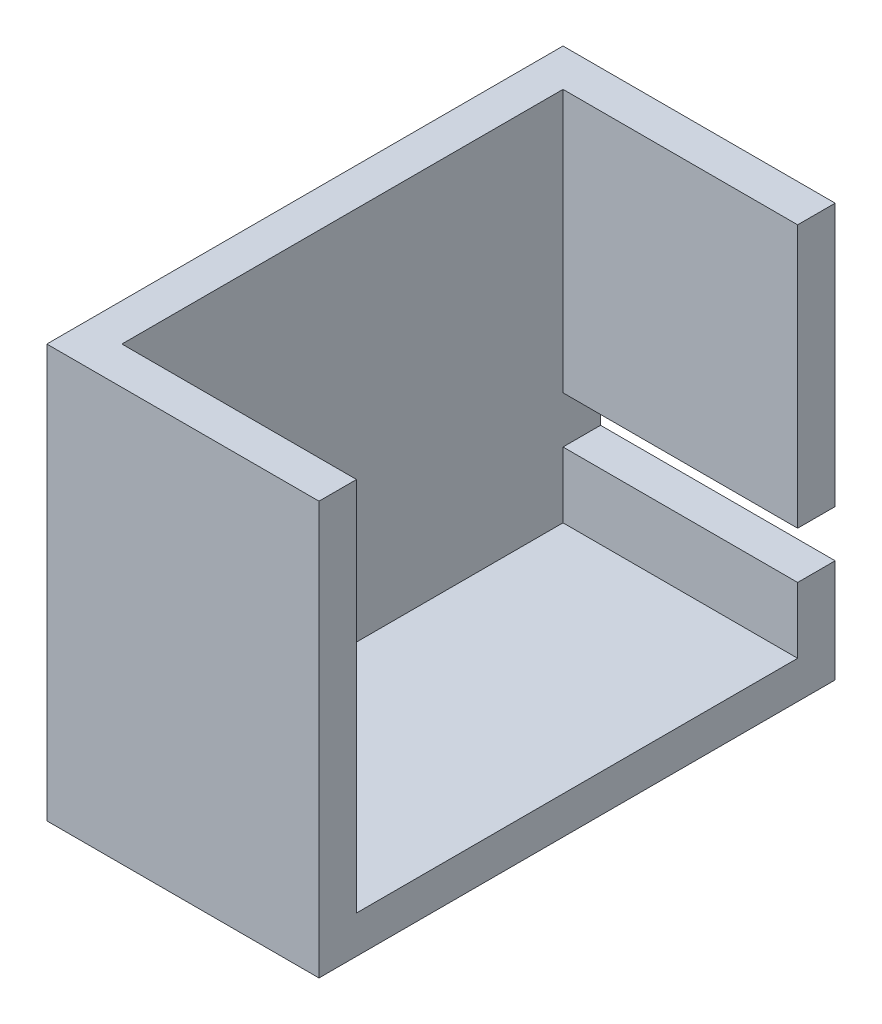
ISO-10303-21;
HEADER;
FILE_DESCRIPTION(('STEP AP214'),'2;1');
FILE_NAME('part.step','',(''),(''),'','','');
FILE_SCHEMA(('AUTOMOTIVE_DESIGN { 1 0 10303 214 1 1 1 1 }'));
ENDSEC;
DATA;
#1=APPLICATION_CONTEXT('core data for automotive mechanical design processes');
#2=APPLICATION_PROTOCOL_DEFINITION('international standard','automotive_design',2000,#1);
#3=PRODUCT_CONTEXT('',#1,'mechanical');
#4=PRODUCT('Part','Part','',(#3));
#5=PRODUCT_RELATED_PRODUCT_CATEGORY('part','',(#4));
#6=PRODUCT_DEFINITION_FORMATION('','',#4);
#7=PRODUCT_DEFINITION_CONTEXT('part definition',#1,'design');
#8=PRODUCT_DEFINITION('design','',#6,#7);
#9=PRODUCT_DEFINITION_SHAPE('','',#8);
#10=(LENGTH_UNIT() NAMED_UNIT(*) SI_UNIT(.MILLI.,.METRE.));
#11=(NAMED_UNIT(*) PLANE_ANGLE_UNIT() SI_UNIT($,.RADIAN.));
#12=(NAMED_UNIT(*) SI_UNIT($,.STERADIAN.) SOLID_ANGLE_UNIT());
#13=UNCERTAINTY_MEASURE_WITH_UNIT(LENGTH_MEASURE(1.E-05),#10,'distance_accuracy_value','');
#14=(GEOMETRIC_REPRESENTATION_CONTEXT(3) GLOBAL_UNCERTAINTY_ASSIGNED_CONTEXT((#13)) GLOBAL_UNIT_ASSIGNED_CONTEXT((#10,
#11,#12)) REPRESENTATION_CONTEXT('',''));
#15=CARTESIAN_POINT('',(0.,0.,0.));
#16=DIRECTION('',(0.,0.,1.));
#17=DIRECTION('',(1.,0.,0.));
#18=AXIS2_PLACEMENT_3D('',#15,#16,#17);
#19=CARTESIAN_POINT('',(12.5,0.,0.));
#20=DIRECTION('',(1.,0.,0.));
#21=DIRECTION('',(0.,0.,-1.));
#22=AXIS2_PLACEMENT_3D('',#19,#20,#21);
#23=PLANE('',#22);
#24=DIRECTION('',(0.,-1.,0.));
#25=VECTOR('',#24,1.);
#26=CARTESIAN_POINT('',(12.5,0.,23.5));
#27=LINE('',#26,#25);
#28=CARTESIAN_POINT('',(12.5,20.,23.5));
#29=VERTEX_POINT('',#28);
#30=CARTESIAN_POINT('',(12.5,0.,23.5));
#31=VERTEX_POINT('',#30);
#32=EDGE_CURVE('E197',#29,#31,#27,.T.);
#33=ORIENTED_EDGE('',*,*,#32,.F.);
#34=DIRECTION('',(0.,0.,1.));
#35=VECTOR('',#34,1.);
#36=CARTESIAN_POINT('',(12.5,20.,0.));
#37=LINE('',#36,#35);
#38=CARTESIAN_POINT('',(12.5,20.,25.5));
#39=VERTEX_POINT('',#38);
#40=EDGE_CURVE('E157',#29,#39,#37,.T.);
#41=ORIENTED_EDGE('',*,*,#40,.T.);
#42=DIRECTION('',(0.,-1.,0.));
#43=VECTOR('',#42,1.);
#44=CARTESIAN_POINT('',(12.5,0.,25.5));
#45=LINE('',#44,#43);
#46=CARTESIAN_POINT('',(12.5,-2.,25.5));
#47=VERTEX_POINT('',#46);
#48=EDGE_CURVE('E245',#39,#47,#45,.T.);
#49=ORIENTED_EDGE('',*,*,#48,.T.);
#50=DIRECTION('',(0.,0.,-1.));
#51=VECTOR('',#50,1.);
#52=CARTESIAN_POINT('',(12.5,-2.,0.));
#53=LINE('',#52,#51);
#54=CARTESIAN_POINT('',(12.5,-2.,-2.));
#55=VERTEX_POINT('',#54);
#56=EDGE_CURVE('E45',#47,#55,#53,.T.);
#57=ORIENTED_EDGE('',*,*,#56,.T.);
#58=DIRECTION('',(0.,1.,0.));
#59=VECTOR('',#58,1.);
#60=CARTESIAN_POINT('',(12.5,0.,-2.));
#61=LINE('',#60,#59);
#62=CARTESIAN_POINT('',(12.5,3.5,-2.));
#63=VERTEX_POINT('',#62);
#64=EDGE_CURVE('E238',#55,#63,#61,.T.);
#65=ORIENTED_EDGE('',*,*,#64,.T.);
#66=DIRECTION('',(0.,0.,-1.));
#67=VECTOR('',#66,1.);
#68=CARTESIAN_POINT('',(12.5,3.5,-2.));
#69=LINE('',#68,#67);
#70=CARTESIAN_POINT('',(12.5,3.5,0.));
#71=VERTEX_POINT('',#70);
#72=EDGE_CURVE('E168',#71,#63,#69,.T.);
#73=ORIENTED_EDGE('',*,*,#72,.F.);
#74=DIRECTION('',(0.,1.,0.));
#75=VECTOR('',#74,1.);
#76=CARTESIAN_POINT('',(12.5,0.,0.));
#77=LINE('',#76,#75);
#78=CARTESIAN_POINT('',(12.5,0.,0.));
#79=VERTEX_POINT('',#78);
#80=EDGE_CURVE('E193',#79,#71,#77,.T.);
#81=ORIENTED_EDGE('',*,*,#80,.F.);
#82=DIRECTION('',(0.,0.,-1.));
#83=VECTOR('',#82,1.);
#84=CARTESIAN_POINT('',(12.5,0.,0.));
#85=LINE('',#84,#83);
#86=EDGE_CURVE('E201',#31,#79,#85,.T.);
#87=ORIENTED_EDGE('',*,*,#86,.F.);
#88=EDGE_LOOP('',(#33,#41,#49,#57,#65,#73,#81,#87));
#89=FACE_BOUND('',#88,.T.);
#90=ADVANCED_FACE('F41',(#89),#23,.T.);
#91=CARTESIAN_POINT('',(12.5,0.,-2.));
#92=DIRECTION('',(0.,0.,1.));
#93=DIRECTION('',(1.,0.,0.));
#94=AXIS2_PLACEMENT_3D('',#91,#92,#93);
#95=PLANE('',#94);
#96=DIRECTION('',(-1.,0.,0.));
#97=VECTOR('',#96,1.);
#98=CARTESIAN_POINT('',(12.5,6.,-2.));
#99=LINE('',#98,#97);
#100=CARTESIAN_POINT('',(12.5,6.,-2.));
#101=VERTEX_POINT('',#100);
#102=CARTESIAN_POINT('',(0.,6.,-2.));
#103=VERTEX_POINT('',#102);
#104=EDGE_CURVE('E172',#101,#103,#99,.T.);
#105=ORIENTED_EDGE('',*,*,#104,.T.);
#106=DIRECTION('',(0.,1.,0.));
#107=VECTOR('',#106,1.);
#108=CARTESIAN_POINT('',(0.,6.,-2.));
#109=LINE('',#108,#107);
#110=CARTESIAN_POINT('',(0.,3.5,-2.));
#111=VERTEX_POINT('',#110);
#112=EDGE_CURVE('E169',#111,#103,#109,.T.);
#113=ORIENTED_EDGE('',*,*,#112,.F.);
#114=DIRECTION('',(-1.,0.,0.));
#115=VECTOR('',#114,1.);
#116=CARTESIAN_POINT('',(12.5,3.5,-2.));
#117=LINE('',#116,#115);
#118=EDGE_CURVE('E182',#63,#111,#117,.T.);
#119=ORIENTED_EDGE('',*,*,#118,.F.);
#120=ORIENTED_EDGE('',*,*,#64,.F.);
#121=DIRECTION('',(-1.,0.,0.));
#122=VECTOR('',#121,1.);
#123=CARTESIAN_POINT('',(12.5,-2.,-2.));
#124=LINE('',#123,#122);
#125=CARTESIAN_POINT('',(-2.,-2.,-2.));
#126=VERTEX_POINT('',#125);
#127=EDGE_CURVE('E219',#55,#126,#124,.T.);
#128=ORIENTED_EDGE('',*,*,#127,.T.);
#129=DIRECTION('',(0.,1.,0.));
#130=VECTOR('',#129,1.);
#131=CARTESIAN_POINT('',(-2.,0.,-2.));
#132=LINE('',#131,#130);
#133=CARTESIAN_POINT('',(-2.,20.,-2.));
#134=VERTEX_POINT('',#133);
#135=EDGE_CURVE('E214',#126,#134,#132,.T.);
#136=ORIENTED_EDGE('',*,*,#135,.T.);
#137=DIRECTION('',(-1.,0.,0.));
#138=VECTOR('',#137,1.);
#139=CARTESIAN_POINT('',(12.5,20.,-2.));
#140=LINE('',#139,#138);
#141=CARTESIAN_POINT('',(12.5,20.,-2.));
#142=VERTEX_POINT('',#141);
#143=EDGE_CURVE('E11',#142,#134,#140,.T.);
#144=ORIENTED_EDGE('',*,*,#143,.F.);
#145=EDGE_CURVE('E237',#101,#142,#61,.T.);
#146=ORIENTED_EDGE('',*,*,#145,.F.);
#147=EDGE_LOOP('',(#105,#113,#119,#120,#128,#136,#144,#146));
#148=FACE_BOUND('',#147,.T.);
#149=ADVANCED_FACE('F262',(#148),#95,.F.);
#150=CARTESIAN_POINT('',(12.5,20.,0.));
#151=VERTEX_POINT('',#150);
#152=EDGE_CURVE('E242',#142,#151,#37,.T.);
#153=ORIENTED_EDGE('',*,*,#152,.T.);
#154=CARTESIAN_POINT('',(12.5,6.,0.));
#155=VERTEX_POINT('',#154);
#156=EDGE_CURVE('E198',#155,#151,#77,.T.);
#157=ORIENTED_EDGE('',*,*,#156,.F.);
#158=DIRECTION('',(0.,0.,1.));
#159=VECTOR('',#158,1.);
#160=CARTESIAN_POINT('',(12.5,6.,0.));
#161=LINE('',#160,#159);
#162=EDGE_CURVE('E165',#101,#155,#161,.T.);
#163=ORIENTED_EDGE('',*,*,#162,.F.);
#164=ORIENTED_EDGE('',*,*,#145,.T.);
#165=EDGE_LOOP('',(#153,#157,#163,#164));
#166=FACE_BOUND('',#165,.T.);
#167=ADVANCED_FACE('F283',(#166),#23,.T.);
#168=CARTESIAN_POINT('',(12.5,0.,0.));
#169=DIRECTION('',(0.,0.,1.));
#170=DIRECTION('',(1.,0.,0.));
#171=AXIS2_PLACEMENT_3D('',#168,#169,#170);
#172=PLANE('',#171);
#173=DIRECTION('',(0.,1.,0.));
#174=VECTOR('',#173,1.);
#175=CARTESIAN_POINT('',(0.,0.,0.));
#176=LINE('',#175,#174);
#177=CARTESIAN_POINT('',(0.,6.,0.));
#178=VERTEX_POINT('',#177);
#179=CARTESIAN_POINT('',(0.,20.,0.));
#180=VERTEX_POINT('',#179);
#181=EDGE_CURVE('E148',#178,#180,#176,.T.);
#182=ORIENTED_EDGE('',*,*,#181,.F.);
#183=DIRECTION('',(-1.,0.,0.));
#184=VECTOR('',#183,1.);
#185=CARTESIAN_POINT('',(12.5,6.,0.));
#186=LINE('',#185,#184);
#187=EDGE_CURVE('E190',#155,#178,#186,.T.);
#188=ORIENTED_EDGE('',*,*,#187,.F.);
#189=ORIENTED_EDGE('',*,*,#156,.T.);
#190=DIRECTION('',(1.,0.,0.));
#191=VECTOR('',#190,1.);
#192=CARTESIAN_POINT('',(12.5,20.,0.));
#193=LINE('',#192,#191);
#194=EDGE_CURVE('E153',#180,#151,#193,.T.);
#195=ORIENTED_EDGE('',*,*,#194,.F.);
#196=EDGE_LOOP('',(#182,#188,#189,#195));
#197=FACE_BOUND('',#196,.T.);
#198=ADVANCED_FACE('F289',(#197),#172,.T.);
#199=ORIENTED_EDGE('',*,*,#80,.T.);
#200=DIRECTION('',(-1.,0.,0.));
#201=VECTOR('',#200,1.);
#202=CARTESIAN_POINT('',(12.5,3.5,0.));
#203=LINE('',#202,#201);
#204=CARTESIAN_POINT('',(0.,3.5,0.));
#205=VERTEX_POINT('',#204);
#206=EDGE_CURVE('E186',#71,#205,#203,.T.);
#207=ORIENTED_EDGE('',*,*,#206,.T.);
#208=CARTESIAN_POINT('',(0.,0.,0.));
#209=VERTEX_POINT('',#208);
#210=EDGE_CURVE('E141',#209,#205,#176,.T.);
#211=ORIENTED_EDGE('',*,*,#210,.F.);
#212=DIRECTION('',(-1.,0.,0.));
#213=VECTOR('',#212,1.);
#214=CARTESIAN_POINT('',(12.5,0.,0.));
#215=LINE('',#214,#213);
#216=EDGE_CURVE('E204',#79,#209,#215,.T.);
#217=ORIENTED_EDGE('',*,*,#216,.F.);
#218=EDGE_LOOP('',(#199,#207,#211,#217));
#219=FACE_BOUND('',#218,.T.);
#220=ADVANCED_FACE('F270',(#219),#172,.T.);
#221=CARTESIAN_POINT('',(12.5,20.,0.));
#222=DIRECTION('',(0.,-1.,0.));
#223=DIRECTION('',(0.,0.,-1.));
#224=AXIS2_PLACEMENT_3D('',#221,#222,#223);
#225=PLANE('',#224);
#226=ORIENTED_EDGE('',*,*,#40,.F.);
#227=DIRECTION('',(-1.,0.,0.));
#228=VECTOR('',#227,1.);
#229=CARTESIAN_POINT('',(0.,20.,23.5));
#230=LINE('',#229,#228);
#231=CARTESIAN_POINT('',(0.,20.,23.5));
#232=VERTEX_POINT('',#231);
#233=EDGE_CURVE('E137',#29,#232,#230,.T.);
#234=ORIENTED_EDGE('',*,*,#233,.T.);
#235=DIRECTION('',(0.,0.,-1.));
#236=VECTOR('',#235,1.);
#237=CARTESIAN_POINT('',(0.,20.,0.));
#238=LINE('',#237,#236);
#239=EDGE_CURVE('E144',#232,#180,#238,.T.);
#240=ORIENTED_EDGE('',*,*,#239,.T.);
#241=ORIENTED_EDGE('',*,*,#194,.T.);
#242=ORIENTED_EDGE('',*,*,#152,.F.);
#243=ORIENTED_EDGE('',*,*,#143,.T.);
#244=DIRECTION('',(0.,0.,1.));
#245=VECTOR('',#244,1.);
#246=CARTESIAN_POINT('',(-2.,20.,0.));
#247=LINE('',#246,#245);
#248=CARTESIAN_POINT('',(-2.,20.,25.5));
#249=VERTEX_POINT('',#248);
#250=EDGE_CURVE('E217',#134,#249,#247,.T.);
#251=ORIENTED_EDGE('',*,*,#250,.T.);
#252=DIRECTION('',(-1.,0.,0.));
#253=VECTOR('',#252,1.);
#254=CARTESIAN_POINT('',(12.5,20.,25.5));
#255=LINE('',#254,#253);
#256=EDGE_CURVE('E51',#39,#249,#255,.T.);
#257=ORIENTED_EDGE('',*,*,#256,.F.);
#258=EDGE_LOOP('',(#226,#234,#240,#241,#242,#243,#251,#257));
#259=FACE_BOUND('',#258,.T.);
#260=ADVANCED_FACE('F155',(#259),#225,.F.);
#261=CARTESIAN_POINT('',(12.5,0.,25.5));
#262=DIRECTION('',(0.,0.,-1.));
#263=DIRECTION('',(-1.,0.,0.));
#264=AXIS2_PLACEMENT_3D('',#261,#262,#263);
#265=PLANE('',#264);
#266=DIRECTION('',(0.,-1.,0.));
#267=VECTOR('',#266,1.);
#268=CARTESIAN_POINT('',(-2.,0.,25.5));
#269=LINE('',#268,#267);
#270=CARTESIAN_POINT('',(-2.,-2.,25.5));
#271=VERTEX_POINT('',#270);
#272=EDGE_CURVE('E226',#249,#271,#269,.T.);
#273=ORIENTED_EDGE('',*,*,#272,.T.);
#274=DIRECTION('',(-1.,0.,0.));
#275=VECTOR('',#274,1.);
#276=CARTESIAN_POINT('',(12.5,-2.,25.5));
#277=LINE('',#276,#275);
#278=EDGE_CURVE('E223',#47,#271,#277,.T.);
#279=ORIENTED_EDGE('',*,*,#278,.F.);
#280=ORIENTED_EDGE('',*,*,#48,.F.);
#281=ORIENTED_EDGE('',*,*,#256,.T.);
#282=EDGE_LOOP('',(#273,#279,#280,#281));
#283=FACE_BOUND('',#282,.T.);
#284=ADVANCED_FACE('F276',(#283),#265,.F.);
#285=CARTESIAN_POINT('',(12.5,-2.,0.));
#286=DIRECTION('',(0.,1.,0.));
#287=DIRECTION('',(0.,0.,1.));
#288=AXIS2_PLACEMENT_3D('',#285,#286,#287);
#289=PLANE('',#288);
#290=DIRECTION('',(0.,0.,-1.));
#291=VECTOR('',#290,1.);
#292=CARTESIAN_POINT('',(-2.,-2.,0.));
#293=LINE('',#292,#291);
#294=EDGE_CURVE('E232',#271,#126,#293,.T.);
#295=ORIENTED_EDGE('',*,*,#294,.T.);
#296=ORIENTED_EDGE('',*,*,#127,.F.);
#297=ORIENTED_EDGE('',*,*,#56,.F.);
#298=ORIENTED_EDGE('',*,*,#278,.T.);
#299=EDGE_LOOP('',(#295,#296,#297,#298));
#300=FACE_BOUND('',#299,.T.);
#301=ADVANCED_FACE('F257',(#300),#289,.F.);
#302=CARTESIAN_POINT('',(-2.,0.,0.));
#303=DIRECTION('',(1.,0.,0.));
#304=DIRECTION('',(0.,0.,-1.));
#305=AXIS2_PLACEMENT_3D('',#302,#303,#304);
#306=PLANE('',#305);
#307=ORIENTED_EDGE('',*,*,#135,.F.);
#308=ORIENTED_EDGE('',*,*,#294,.F.);
#309=ORIENTED_EDGE('',*,*,#272,.F.);
#310=ORIENTED_EDGE('',*,*,#250,.F.);
#311=EDGE_LOOP('',(#307,#308,#309,#310));
#312=FACE_BOUND('',#311,.T.);
#313=ADVANCED_FACE('F43',(#312),#306,.F.);
#314=CARTESIAN_POINT('',(12.5,0.,23.5));
#315=DIRECTION('',(0.,0.,-1.));
#316=DIRECTION('',(-1.,0.,0.));
#317=AXIS2_PLACEMENT_3D('',#314,#315,#316);
#318=PLANE('',#317);
#319=DIRECTION('',(0.,-1.,0.));
#320=VECTOR('',#319,1.);
#321=CARTESIAN_POINT('',(0.,0.,23.5));
#322=LINE('',#321,#320);
#323=CARTESIAN_POINT('',(0.,0.,23.5));
#324=VERTEX_POINT('',#323);
#325=EDGE_CURVE('E133',#232,#324,#322,.T.);
#326=ORIENTED_EDGE('',*,*,#325,.F.);
#327=ORIENTED_EDGE('',*,*,#233,.F.);
#328=ORIENTED_EDGE('',*,*,#32,.T.);
#329=DIRECTION('',(-1.,0.,0.));
#330=VECTOR('',#329,1.);
#331=CARTESIAN_POINT('',(12.5,0.,23.5));
#332=LINE('',#331,#330);
#333=EDGE_CURVE('E67',#31,#324,#332,.T.);
#334=ORIENTED_EDGE('',*,*,#333,.T.);
#335=EDGE_LOOP('',(#326,#327,#328,#334));
#336=FACE_BOUND('',#335,.T.);
#337=ADVANCED_FACE('F135',(#336),#318,.T.);
#338=CARTESIAN_POINT('',(12.5,0.,0.));
#339=DIRECTION('',(0.,1.,0.));
#340=DIRECTION('',(0.,0.,1.));
#341=AXIS2_PLACEMENT_3D('',#338,#339,#340);
#342=PLANE('',#341);
#343=DIRECTION('',(0.,0.,-1.));
#344=VECTOR('',#343,1.);
#345=CARTESIAN_POINT('',(0.,0.,0.));
#346=LINE('',#345,#344);
#347=EDGE_CURVE('E140',#324,#209,#346,.T.);
#348=ORIENTED_EDGE('',*,*,#347,.F.);
#349=ORIENTED_EDGE('',*,*,#333,.F.);
#350=ORIENTED_EDGE('',*,*,#86,.T.);
#351=ORIENTED_EDGE('',*,*,#216,.T.);
#352=EDGE_LOOP('',(#348,#349,#350,#351));
#353=FACE_BOUND('',#352,.T.);
#354=ADVANCED_FACE('F272',(#353),#342,.T.);
#355=CARTESIAN_POINT('',(0.,0.,0.));
#356=DIRECTION('',(1.,0.,0.));
#357=DIRECTION('',(0.,0.,-1.));
#358=AXIS2_PLACEMENT_3D('',#355,#356,#357);
#359=PLANE('',#358);
#360=ORIENTED_EDGE('',*,*,#210,.T.);
#361=DIRECTION('',(0.,0.,-1.));
#362=VECTOR('',#361,1.);
#363=CARTESIAN_POINT('',(0.,3.5,-2.));
#364=LINE('',#363,#362);
#365=EDGE_CURVE('E175',#205,#111,#364,.T.);
#366=ORIENTED_EDGE('',*,*,#365,.T.);
#367=ORIENTED_EDGE('',*,*,#112,.T.);
#368=DIRECTION('',(0.,0.,1.));
#369=VECTOR('',#368,1.);
#370=CARTESIAN_POINT('',(0.,6.,0.));
#371=LINE('',#370,#369);
#372=EDGE_CURVE('E59',#103,#178,#371,.T.);
#373=ORIENTED_EDGE('',*,*,#372,.T.);
#374=ORIENTED_EDGE('',*,*,#181,.T.);
#375=ORIENTED_EDGE('',*,*,#239,.F.);
#376=ORIENTED_EDGE('',*,*,#325,.T.);
#377=ORIENTED_EDGE('',*,*,#347,.T.);
#378=EDGE_LOOP('',(#360,#366,#367,#373,#374,#375,#376,#377));
#379=FACE_BOUND('',#378,.T.);
#380=ADVANCED_FACE('F146',(#379),#359,.T.);
#381=CARTESIAN_POINT('',(12.5,6.,0.));
#382=DIRECTION('',(0.,-1.,0.));
#383=DIRECTION('',(0.,0.,-1.));
#384=AXIS2_PLACEMENT_3D('',#381,#382,#383);
#385=PLANE('',#384);
#386=ORIENTED_EDGE('',*,*,#372,.F.);
#387=ORIENTED_EDGE('',*,*,#104,.F.);
#388=ORIENTED_EDGE('',*,*,#162,.T.);
#389=ORIENTED_EDGE('',*,*,#187,.T.);
#390=EDGE_LOOP('',(#386,#387,#388,#389));
#391=FACE_BOUND('',#390,.T.);
#392=ADVANCED_FACE('F291',(#391),#385,.T.);
#393=CARTESIAN_POINT('',(12.5,3.5,-2.));
#394=DIRECTION('',(0.,1.,0.));
#395=DIRECTION('',(0.,0.,1.));
#396=AXIS2_PLACEMENT_3D('',#393,#394,#395);
#397=PLANE('',#396);
#398=ORIENTED_EDGE('',*,*,#365,.F.);
#399=ORIENTED_EDGE('',*,*,#206,.F.);
#400=ORIENTED_EDGE('',*,*,#72,.T.);
#401=ORIENTED_EDGE('',*,*,#118,.T.);
#402=EDGE_LOOP('',(#398,#399,#400,#401));
#403=FACE_BOUND('',#402,.T.);
#404=ADVANCED_FACE('F265',(#403),#397,.T.);
#405=CLOSED_SHELL('',(#90,#149,#167,#198,#220,#260,#284,#301,#313,#337,#354,#380,#392,#404));
#406=MANIFOLD_SOLID_BREP('B2',#405);
#407=ADVANCED_BREP_SHAPE_REPRESENTATION('',(#18,#406),#14);
#408=SHAPE_DEFINITION_REPRESENTATION(#9,#407);
ENDSEC;
END-ISO-10303-21;
